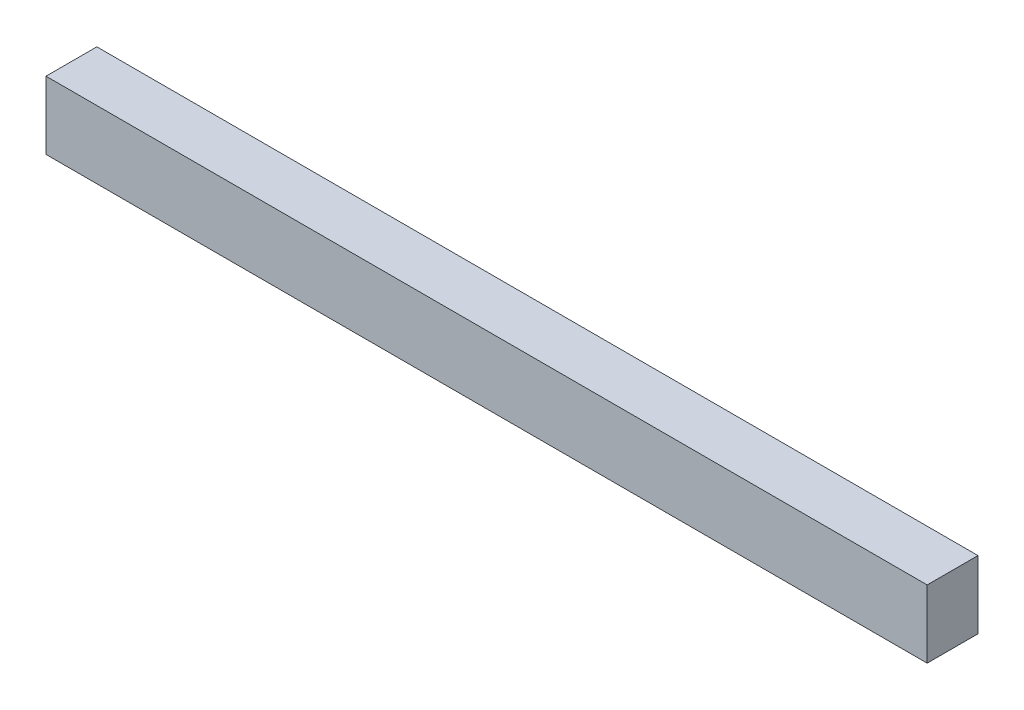
ISO-10303-21;
HEADER;
FILE_DESCRIPTION(('STEP AP214'),'2;1');
FILE_NAME('part.step','',(''),(''),'','','');
FILE_SCHEMA(('AUTOMOTIVE_DESIGN { 1 0 10303 214 1 1 1 1 }'));
ENDSEC;
DATA;
#1=APPLICATION_CONTEXT('core data for automotive mechanical design processes');
#2=APPLICATION_PROTOCOL_DEFINITION('international standard','automotive_design',2000,#1);
#3=PRODUCT_CONTEXT('',#1,'mechanical');
#4=PRODUCT('Part','Part','',(#3));
#5=PRODUCT_RELATED_PRODUCT_CATEGORY('part','',(#4));
#6=PRODUCT_DEFINITION_FORMATION('','',#4);
#7=PRODUCT_DEFINITION_CONTEXT('part definition',#1,'design');
#8=PRODUCT_DEFINITION('design','',#6,#7);
#9=PRODUCT_DEFINITION_SHAPE('','',#8);
#10=(LENGTH_UNIT() NAMED_UNIT(*) SI_UNIT(.MILLI.,.METRE.));
#11=(NAMED_UNIT(*) PLANE_ANGLE_UNIT() SI_UNIT($,.RADIAN.));
#12=(NAMED_UNIT(*) SI_UNIT($,.STERADIAN.) SOLID_ANGLE_UNIT());
#13=UNCERTAINTY_MEASURE_WITH_UNIT(LENGTH_MEASURE(1.E-05),#10,'distance_accuracy_value','');
#14=(GEOMETRIC_REPRESENTATION_CONTEXT(3) GLOBAL_UNCERTAINTY_ASSIGNED_CONTEXT((#13)) GLOBAL_UNIT_ASSIGNED_CONTEXT((#10,
#11,#12)) REPRESENTATION_CONTEXT('',''));
#15=CARTESIAN_POINT('',(0.,0.,0.));
#16=DIRECTION('',(0.,0.,1.));
#17=DIRECTION('',(1.,0.,0.));
#18=AXIS2_PLACEMENT_3D('',#15,#16,#17);
#19=CARTESIAN_POINT('',(0.,0.,30.));
#20=DIRECTION('',(1.,0.,0.));
#21=DIRECTION('',(0.,0.,-1.));
#22=AXIS2_PLACEMENT_3D('',#19,#20,#21);
#23=PLANE('',#22);
#24=DIRECTION('',(0.,-1.,0.));
#25=VECTOR('',#24,1.);
#26=CARTESIAN_POINT('',(0.,0.,0.));
#27=LINE('',#26,#25);
#28=CARTESIAN_POINT('',(0.,40.,0.));
#29=VERTEX_POINT('',#28);
#30=CARTESIAN_POINT('',(0.,0.,0.));
#31=VERTEX_POINT('',#30);
#32=EDGE_CURVE('E96',#29,#31,#27,.T.);
#33=ORIENTED_EDGE('',*,*,#32,.T.);
#34=DIRECTION('',(0.,0.,-1.));
#35=VECTOR('',#34,1.);
#36=CARTESIAN_POINT('',(0.,0.,30.));
#37=LINE('',#36,#35);
#38=CARTESIAN_POINT('',(0.,0.,30.));
#39=VERTEX_POINT('',#38);
#40=EDGE_CURVE('E11',#39,#31,#37,.T.);
#41=ORIENTED_EDGE('',*,*,#40,.F.);
#42=DIRECTION('',(0.,-1.,0.));
#43=VECTOR('',#42,1.);
#44=CARTESIAN_POINT('',(0.,0.,30.));
#45=LINE('',#44,#43);
#46=CARTESIAN_POINT('',(0.,40.,30.));
#47=VERTEX_POINT('',#46);
#48=EDGE_CURVE('E84',#47,#39,#45,.T.);
#49=ORIENTED_EDGE('',*,*,#48,.F.);
#50=DIRECTION('',(0.,0.,-1.));
#51=VECTOR('',#50,1.);
#52=CARTESIAN_POINT('',(0.,40.,30.));
#53=LINE('',#52,#51);
#54=EDGE_CURVE('E92',#47,#29,#53,.T.);
#55=ORIENTED_EDGE('',*,*,#54,.T.);
#56=EDGE_LOOP('',(#33,#41,#49,#55));
#57=FACE_BOUND('',#56,.T.);
#58=ADVANCED_FACE('F33',(#57),#23,.F.);
#59=CARTESIAN_POINT('',(0.,0.,30.));
#60=DIRECTION('',(0.,1.,0.));
#61=DIRECTION('',(0.,0.,1.));
#62=AXIS2_PLACEMENT_3D('',#59,#60,#61);
#63=PLANE('',#62);
#64=DIRECTION('',(1.,0.,0.));
#65=VECTOR('',#64,1.);
#66=CARTESIAN_POINT('',(0.,0.,0.));
#67=LINE('',#66,#65);
#68=CARTESIAN_POINT('',(520.,0.,0.));
#69=VERTEX_POINT('',#68);
#70=EDGE_CURVE('E88',#31,#69,#67,.T.);
#71=ORIENTED_EDGE('',*,*,#70,.T.);
#72=DIRECTION('',(0.,0.,-1.));
#73=VECTOR('',#72,1.);
#74=CARTESIAN_POINT('',(520.,0.,30.));
#75=LINE('',#74,#73);
#76=CARTESIAN_POINT('',(520.,0.,30.));
#77=VERTEX_POINT('',#76);
#78=EDGE_CURVE('E41',#77,#69,#75,.T.);
#79=ORIENTED_EDGE('',*,*,#78,.F.);
#80=DIRECTION('',(1.,0.,0.));
#81=VECTOR('',#80,1.);
#82=CARTESIAN_POINT('',(0.,0.,30.));
#83=LINE('',#82,#81);
#84=EDGE_CURVE('E79',#39,#77,#83,.T.);
#85=ORIENTED_EDGE('',*,*,#84,.F.);
#86=ORIENTED_EDGE('',*,*,#40,.T.);
#87=EDGE_LOOP('',(#71,#79,#85,#86));
#88=FACE_BOUND('',#87,.T.);
#89=ADVANCED_FACE('F87',(#88),#63,.F.);
#90=CARTESIAN_POINT('',(520.,0.,30.));
#91=DIRECTION('',(-1.,0.,0.));
#92=DIRECTION('',(0.,0.,1.));
#93=AXIS2_PLACEMENT_3D('',#90,#91,#92);
#94=PLANE('',#93);
#95=DIRECTION('',(0.,1.,0.));
#96=VECTOR('',#95,1.);
#97=CARTESIAN_POINT('',(520.,0.,0.));
#98=LINE('',#97,#96);
#99=CARTESIAN_POINT('',(520.,40.,0.));
#100=VERTEX_POINT('',#99);
#101=EDGE_CURVE('E66',#69,#100,#98,.T.);
#102=ORIENTED_EDGE('',*,*,#101,.T.);
#103=DIRECTION('',(0.,0.,-1.));
#104=VECTOR('',#103,1.);
#105=CARTESIAN_POINT('',(520.,40.,30.));
#106=LINE('',#105,#104);
#107=CARTESIAN_POINT('',(520.,40.,30.));
#108=VERTEX_POINT('',#107);
#109=EDGE_CURVE('E89',#108,#100,#106,.T.);
#110=ORIENTED_EDGE('',*,*,#109,.F.);
#111=DIRECTION('',(0.,1.,0.));
#112=VECTOR('',#111,1.);
#113=CARTESIAN_POINT('',(520.,0.,30.));
#114=LINE('',#113,#112);
#115=EDGE_CURVE('E82',#77,#108,#114,.T.);
#116=ORIENTED_EDGE('',*,*,#115,.F.);
#117=ORIENTED_EDGE('',*,*,#78,.T.);
#118=EDGE_LOOP('',(#102,#110,#116,#117));
#119=FACE_BOUND('',#118,.T.);
#120=ADVANCED_FACE('F90',(#119),#94,.F.);
#121=CARTESIAN_POINT('',(0.,40.,30.));
#122=DIRECTION('',(0.,-1.,0.));
#123=DIRECTION('',(0.,0.,-1.));
#124=AXIS2_PLACEMENT_3D('',#121,#122,#123);
#125=PLANE('',#124);
#126=DIRECTION('',(-1.,0.,0.));
#127=VECTOR('',#126,1.);
#128=CARTESIAN_POINT('',(0.,40.,0.));
#129=LINE('',#128,#127);
#130=EDGE_CURVE('E72',#100,#29,#129,.T.);
#131=ORIENTED_EDGE('',*,*,#130,.T.);
#132=ORIENTED_EDGE('',*,*,#54,.F.);
#133=DIRECTION('',(-1.,0.,0.));
#134=VECTOR('',#133,1.);
#135=CARTESIAN_POINT('',(0.,40.,30.));
#136=LINE('',#135,#134);
#137=EDGE_CURVE('E49',#108,#47,#136,.T.);
#138=ORIENTED_EDGE('',*,*,#137,.F.);
#139=ORIENTED_EDGE('',*,*,#109,.T.);
#140=EDGE_LOOP('',(#131,#132,#138,#139));
#141=FACE_BOUND('',#140,.T.);
#142=ADVANCED_FACE('F103',(#141),#125,.F.);
#143=CARTESIAN_POINT('',(0.,0.,30.));
#144=DIRECTION('',(0.,0.,-1.));
#145=DIRECTION('',(-1.,0.,0.));
#146=AXIS2_PLACEMENT_3D('',#143,#144,#145);
#147=PLANE('',#146);
#148=ORIENTED_EDGE('',*,*,#48,.T.);
#149=ORIENTED_EDGE('',*,*,#84,.T.);
#150=ORIENTED_EDGE('',*,*,#115,.T.);
#151=ORIENTED_EDGE('',*,*,#137,.T.);
#152=EDGE_LOOP('',(#148,#149,#150,#151));
#153=FACE_BOUND('',#152,.T.);
#154=ADVANCED_FACE('F80',(#153),#147,.F.);
#155=CARTESIAN_POINT('',(0.,0.,0.));
#156=DIRECTION('',(0.,0.,-1.));
#157=DIRECTION('',(-1.,0.,0.));
#158=AXIS2_PLACEMENT_3D('',#155,#156,#157);
#159=PLANE('',#158);
#160=ORIENTED_EDGE('',*,*,#32,.F.);
#161=ORIENTED_EDGE('',*,*,#130,.F.);
#162=ORIENTED_EDGE('',*,*,#101,.F.);
#163=ORIENTED_EDGE('',*,*,#70,.F.);
#164=EDGE_LOOP('',(#160,#161,#162,#163));
#165=FACE_BOUND('',#164,.T.);
#166=ADVANCED_FACE('F106',(#165),#159,.T.);
#167=CLOSED_SHELL('',(#58,#89,#120,#142,#154,#166));
#168=MANIFOLD_SOLID_BREP('B2',#167);
#169=ADVANCED_BREP_SHAPE_REPRESENTATION('',(#18,#168),#14);
#170=SHAPE_DEFINITION_REPRESENTATION(#9,#169);
ENDSEC;
END-ISO-10303-21;
